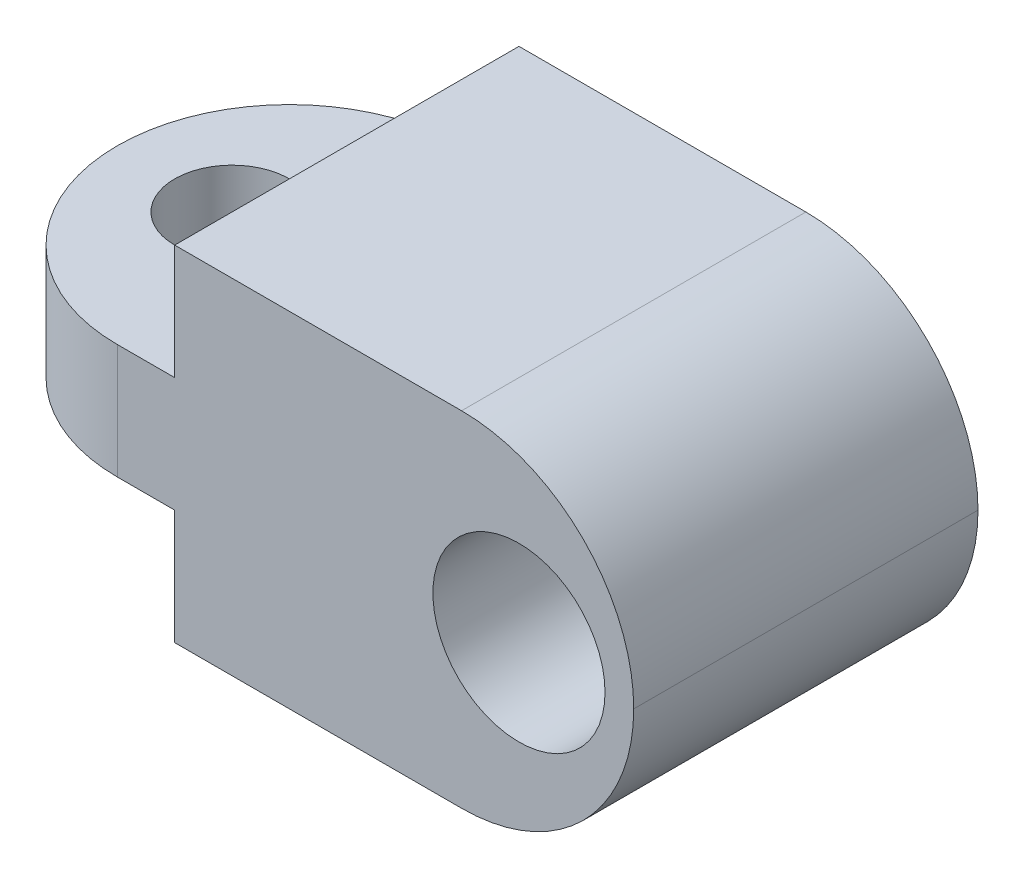
ISO-10303-21;
HEADER;
FILE_DESCRIPTION(('STEP AP214'),'2;1');
FILE_NAME('part.step','',(''),(''),'','','');
FILE_SCHEMA(('AUTOMOTIVE_DESIGN { 1 0 10303 214 1 1 1 1 }'));
ENDSEC;
DATA;
#1=APPLICATION_CONTEXT('core data for automotive mechanical design processes');
#2=APPLICATION_PROTOCOL_DEFINITION('international standard','automotive_design',2000,#1);
#3=PRODUCT_CONTEXT('',#1,'mechanical');
#4=PRODUCT('Part','Part','',(#3));
#5=PRODUCT_RELATED_PRODUCT_CATEGORY('part','',(#4));
#6=PRODUCT_DEFINITION_FORMATION('','',#4);
#7=PRODUCT_DEFINITION_CONTEXT('part definition',#1,'design');
#8=PRODUCT_DEFINITION('design','',#6,#7);
#9=PRODUCT_DEFINITION_SHAPE('','',#8);
#10=(LENGTH_UNIT() NAMED_UNIT(*) SI_UNIT(.MILLI.,.METRE.));
#11=(NAMED_UNIT(*) PLANE_ANGLE_UNIT() SI_UNIT($,.RADIAN.));
#12=(NAMED_UNIT(*) SI_UNIT($,.STERADIAN.) SOLID_ANGLE_UNIT());
#13=UNCERTAINTY_MEASURE_WITH_UNIT(LENGTH_MEASURE(1.E-05),#10,'distance_accuracy_value','');
#14=(GEOMETRIC_REPRESENTATION_CONTEXT(3) GLOBAL_UNCERTAINTY_ASSIGNED_CONTEXT((#13)) GLOBAL_UNIT_ASSIGNED_CONTEXT((#10,
#11,#12)) REPRESENTATION_CONTEXT('',''));
#15=CARTESIAN_POINT('',(0.,0.,0.));
#16=DIRECTION('',(0.,0.,1.));
#17=DIRECTION('',(1.,0.,0.));
#18=AXIS2_PLACEMENT_3D('',#15,#16,#17);
#19=CARTESIAN_POINT('',(-60.,30.,60.));
#20=DIRECTION('',(0.,-1.,0.));
#21=DIRECTION('',(0.,0.,-1.));
#22=AXIS2_PLACEMENT_3D('',#19,#20,#21);
#23=PLANE('',#22);
#24=DIRECTION('',(0.,0.,-1.));
#25=VECTOR('',#24,1.);
#26=CARTESIAN_POINT('',(-20.,30.,60.));
#27=LINE('',#26,#25);
#28=CARTESIAN_POINT('',(-20.,30.,60.));
#29=VERTEX_POINT('',#28);
#30=CARTESIAN_POINT('',(-20.,30.,0.));
#31=VERTEX_POINT('',#30);
#32=EDGE_CURVE('E133',#29,#31,#27,.T.);
#33=ORIENTED_EDGE('',*,*,#32,.F.);
#34=DIRECTION('',(-1.,0.,0.));
#35=VECTOR('',#34,1.);
#36=CARTESIAN_POINT('',(-60.,30.,60.));
#37=LINE('',#36,#35);
#38=CARTESIAN_POINT('',(30.,30.,60.));
#39=VERTEX_POINT('',#38);
#40=EDGE_CURVE('E138',#39,#29,#37,.T.);
#41=ORIENTED_EDGE('',*,*,#40,.F.);
#42=DIRECTION('',(0.,0.,-1.));
#43=VECTOR('',#42,1.);
#44=CARTESIAN_POINT('',(30.,30.,60.));
#45=LINE('',#44,#43);
#46=CARTESIAN_POINT('',(30.,30.,0.));
#47=VERTEX_POINT('',#46);
#48=EDGE_CURVE('E182',#39,#47,#45,.T.);
#49=ORIENTED_EDGE('',*,*,#48,.T.);
#50=DIRECTION('',(-1.,0.,0.));
#51=VECTOR('',#50,1.);
#52=CARTESIAN_POINT('',(-60.,30.,0.));
#53=LINE('',#52,#51);
#54=EDGE_CURVE('E167',#47,#31,#53,.T.);
#55=ORIENTED_EDGE('',*,*,#54,.T.);
#56=EDGE_LOOP('',(#33,#41,#49,#55));
#57=FACE_BOUND('',#56,.T.);
#58=ADVANCED_FACE('F39',(#57),#23,.F.);
#59=CARTESIAN_POINT('',(-60.,-30.,60.));
#60=DIRECTION('',(0.,1.,0.));
#61=DIRECTION('',(0.,0.,1.));
#62=AXIS2_PLACEMENT_3D('',#59,#60,#61);
#63=PLANE('',#62);
#64=DIRECTION('',(0.,0.,-1.));
#65=VECTOR('',#64,1.);
#66=CARTESIAN_POINT('',(-20.,-30.,60.));
#67=LINE('',#66,#65);
#68=CARTESIAN_POINT('',(-20.,-30.,60.));
#69=VERTEX_POINT('',#68);
#70=CARTESIAN_POINT('',(-20.,-30.,0.));
#71=VERTEX_POINT('',#70);
#72=EDGE_CURVE('E145',#69,#71,#67,.T.);
#73=ORIENTED_EDGE('',*,*,#72,.T.);
#74=DIRECTION('',(1.,0.,0.));
#75=VECTOR('',#74,1.);
#76=CARTESIAN_POINT('',(-60.,-30.,0.));
#77=LINE('',#76,#75);
#78=CARTESIAN_POINT('',(30.,-30.,0.));
#79=VERTEX_POINT('',#78);
#80=EDGE_CURVE('E164',#71,#79,#77,.T.);
#81=ORIENTED_EDGE('',*,*,#80,.T.);
#82=DIRECTION('',(0.,0.,-1.));
#83=VECTOR('',#82,1.);
#84=CARTESIAN_POINT('',(30.,-30.,60.));
#85=LINE('',#84,#83);
#86=CARTESIAN_POINT('',(30.,-30.,60.));
#87=VERTEX_POINT('',#86);
#88=EDGE_CURVE('E175',#79,#87,#85,.F.);
#89=ORIENTED_EDGE('',*,*,#88,.T.);
#90=DIRECTION('',(1.,0.,0.));
#91=VECTOR('',#90,1.);
#92=CARTESIAN_POINT('',(-60.,-30.,60.));
#93=LINE('',#92,#91);
#94=EDGE_CURVE('E163',#69,#87,#93,.T.);
#95=ORIENTED_EDGE('',*,*,#94,.F.);
#96=EDGE_LOOP('',(#73,#81,#89,#95));
#97=FACE_BOUND('',#96,.T.);
#98=ADVANCED_FACE('F232',(#97),#63,.F.);
#99=CARTESIAN_POINT('',(0.,0.,60.));
#100=DIRECTION('',(0.,0.,-1.));
#101=DIRECTION('',(-1.,0.,0.));
#102=AXIS2_PLACEMENT_3D('',#99,#100,#101);
#103=PLANE('',#102);
#104=CARTESIAN_POINT('',(40.,0.,60.0000000000001));
#105=DIRECTION('',(0.,0.,1.));
#106=DIRECTION('',(1.,0.,0.));
#107=AXIS2_PLACEMENT_3D('',#104,#105,#106);
#108=CIRCLE('',#107,15.);
#109=CARTESIAN_POINT('',(55.,0.,60.0000000000001));
#110=VERTEX_POINT('',#109);
#111=EDGE_CURVE('E204',#110,#110,#108,.T.);
#112=ORIENTED_EDGE('',*,*,#111,.F.);
#113=EDGE_LOOP('',(#112));
#114=FACE_BOUND('',#113,.T.);
#115=DIRECTION('',(1.,0.,0.));
#116=VECTOR('',#115,1.);
#117=CARTESIAN_POINT('',(-60.,10.,60.));
#118=LINE('',#117,#116);
#119=CARTESIAN_POINT('',(-30.,10.,60.));
#120=VERTEX_POINT('',#119);
#121=CARTESIAN_POINT('',(-20.,10.,60.));
#122=VERTEX_POINT('',#121);
#123=EDGE_CURVE('E115',#120,#122,#118,.T.);
#124=ORIENTED_EDGE('',*,*,#123,.F.);
#125=DIRECTION('',(0.,-1.,0.));
#126=VECTOR('',#125,1.);
#127=CARTESIAN_POINT('',(-30.,0.,60.));
#128=LINE('',#127,#126);
#129=CARTESIAN_POINT('',(-30.,-10.,60.));
#130=VERTEX_POINT('',#129);
#131=EDGE_CURVE('E184',#120,#130,#128,.T.);
#132=ORIENTED_EDGE('',*,*,#131,.T.);
#133=DIRECTION('',(-1.,0.,0.));
#134=VECTOR('',#133,1.);
#135=CARTESIAN_POINT('',(-60.,-10.,60.));
#136=LINE('',#135,#134);
#137=CARTESIAN_POINT('',(-20.,-10.,60.));
#138=VERTEX_POINT('',#137);
#139=EDGE_CURVE('E149',#138,#130,#136,.T.);
#140=ORIENTED_EDGE('',*,*,#139,.F.);
#141=DIRECTION('',(0.,1.,0.));
#142=VECTOR('',#141,1.);
#143=CARTESIAN_POINT('',(-20.,-30.,60.));
#144=LINE('',#143,#142);
#145=EDGE_CURVE('E147',#69,#138,#144,.T.);
#146=ORIENTED_EDGE('',*,*,#145,.F.);
#147=ORIENTED_EDGE('',*,*,#94,.T.);
#148=CARTESIAN_POINT('',(30.,0.,60.));
#149=DIRECTION('',(0.,0.,-1.));
#150=DIRECTION('',(-1.,0.,0.));
#151=AXIS2_PLACEMENT_3D('',#148,#149,#150);
#152=CIRCLE('',#151,30.);
#153=CARTESIAN_POINT('',(60.,0.,60.));
#154=VERTEX_POINT('',#153);
#155=EDGE_CURVE('E180',#87,#154,#152,.F.);
#156=ORIENTED_EDGE('',*,*,#155,.T.);
#157=CARTESIAN_POINT('',(30.,0.,60.));
#158=DIRECTION('',(0.,0.,-1.));
#159=DIRECTION('',(-1.,0.,0.));
#160=AXIS2_PLACEMENT_3D('',#157,#158,#159);
#161=CIRCLE('',#160,30.);
#162=EDGE_CURVE('E178',#154,#39,#161,.F.);
#163=ORIENTED_EDGE('',*,*,#162,.T.);
#164=ORIENTED_EDGE('',*,*,#40,.T.);
#165=DIRECTION('',(0.,1.,0.));
#166=VECTOR('',#165,1.);
#167=CARTESIAN_POINT('',(-20.,30.,60.));
#168=LINE('',#167,#166);
#169=EDGE_CURVE('E125',#122,#29,#168,.T.);
#170=ORIENTED_EDGE('',*,*,#169,.F.);
#171=EDGE_LOOP('',(#124,#132,#140,#146,#147,#156,#163,#164,#170));
#172=FACE_BOUND('',#171,.T.);
#173=ADVANCED_FACE('F136',(#114,#172),#103,.F.);
#174=CARTESIAN_POINT('',(0.,0.,0.));
#175=DIRECTION('',(0.,0.,-1.));
#176=DIRECTION('',(-1.,0.,0.));
#177=AXIS2_PLACEMENT_3D('',#174,#175,#176);
#178=PLANE('',#177);
#179=CARTESIAN_POINT('',(40.,0.,0.));
#180=DIRECTION('',(0.,0.,1.));
#181=DIRECTION('',(1.,0.,0.));
#182=AXIS2_PLACEMENT_3D('',#179,#180,#181);
#183=CIRCLE('',#182,15.);
#184=CARTESIAN_POINT('',(55.,0.,0.));
#185=VERTEX_POINT('',#184);
#186=EDGE_CURVE('E208',#185,#185,#183,.T.);
#187=ORIENTED_EDGE('',*,*,#186,.T.);
#188=EDGE_LOOP('',(#187));
#189=FACE_BOUND('',#188,.T.);
#190=DIRECTION('',(-1.,0.,0.));
#191=VECTOR('',#190,1.);
#192=CARTESIAN_POINT('',(-60.,-10.,0.));
#193=LINE('',#192,#191);
#194=CARTESIAN_POINT('',(-20.,-10.,0.));
#195=VERTEX_POINT('',#194);
#196=CARTESIAN_POINT('',(-30.,-10.,0.));
#197=VERTEX_POINT('',#196);
#198=EDGE_CURVE('E150',#195,#197,#193,.T.);
#199=ORIENTED_EDGE('',*,*,#198,.T.);
#200=DIRECTION('',(0.,-1.,0.));
#201=VECTOR('',#200,1.);
#202=CARTESIAN_POINT('',(-30.,10.,0.));
#203=LINE('',#202,#201);
#204=CARTESIAN_POINT('',(-30.,10.,0.));
#205=VERTEX_POINT('',#204);
#206=EDGE_CURVE('E11',#197,#205,#203,.F.);
#207=ORIENTED_EDGE('',*,*,#206,.T.);
#208=DIRECTION('',(1.,0.,0.));
#209=VECTOR('',#208,1.);
#210=CARTESIAN_POINT('',(-60.,10.,0.));
#211=LINE('',#210,#209);
#212=CARTESIAN_POINT('',(-20.,10.,0.));
#213=VERTEX_POINT('',#212);
#214=EDGE_CURVE('E143',#205,#213,#211,.T.);
#215=ORIENTED_EDGE('',*,*,#214,.T.);
#216=DIRECTION('',(0.,1.,0.));
#217=VECTOR('',#216,1.);
#218=CARTESIAN_POINT('',(-20.,30.,0.));
#219=LINE('',#218,#217);
#220=EDGE_CURVE('E126',#213,#31,#219,.T.);
#221=ORIENTED_EDGE('',*,*,#220,.T.);
#222=ORIENTED_EDGE('',*,*,#54,.F.);
#223=CARTESIAN_POINT('',(30.,0.,0.));
#224=DIRECTION('',(0.,0.,-1.));
#225=DIRECTION('',(-1.,0.,0.));
#226=AXIS2_PLACEMENT_3D('',#223,#224,#225);
#227=CIRCLE('',#226,30.);
#228=CARTESIAN_POINT('',(60.,0.,0.));
#229=VERTEX_POINT('',#228);
#230=EDGE_CURVE('E166',#47,#229,#227,.T.);
#231=ORIENTED_EDGE('',*,*,#230,.T.);
#232=CARTESIAN_POINT('',(30.,0.,0.));
#233=DIRECTION('',(0.,0.,-1.));
#234=DIRECTION('',(-1.,0.,0.));
#235=AXIS2_PLACEMENT_3D('',#232,#233,#234);
#236=CIRCLE('',#235,30.);
#237=EDGE_CURVE('E172',#229,#79,#236,.T.);
#238=ORIENTED_EDGE('',*,*,#237,.T.);
#239=ORIENTED_EDGE('',*,*,#80,.F.);
#240=DIRECTION('',(0.,1.,0.));
#241=VECTOR('',#240,1.);
#242=CARTESIAN_POINT('',(-20.,-30.,0.));
#243=LINE('',#242,#241);
#244=EDGE_CURVE('E154',#71,#195,#243,.T.);
#245=ORIENTED_EDGE('',*,*,#244,.T.);
#246=EDGE_LOOP('',(#199,#207,#215,#221,#222,#231,#238,#239,#245));
#247=FACE_BOUND('',#246,.T.);
#248=ADVANCED_FACE('F248',(#189,#247),#178,.T.);
#249=CARTESIAN_POINT('',(30.,0.,60.));
#250=DIRECTION('',(0.,0.,-1.));
#251=DIRECTION('',(-1.,0.,0.));
#252=AXIS2_PLACEMENT_3D('',#249,#250,#251);
#253=CYLINDRICAL_SURFACE('',#252,30.);
#254=ORIENTED_EDGE('',*,*,#48,.F.);
#255=ORIENTED_EDGE('',*,*,#162,.F.);
#256=DIRECTION('',(0.,0.,-1.));
#257=VECTOR('',#256,1.);
#258=CARTESIAN_POINT('',(60.,0.,60.));
#259=LINE('',#258,#257);
#260=EDGE_CURVE('E132',#229,#154,#259,.F.);
#261=ORIENTED_EDGE('',*,*,#260,.F.);
#262=ORIENTED_EDGE('',*,*,#230,.F.);
#263=EDGE_LOOP('',(#254,#255,#261,#262));
#264=FACE_BOUND('',#263,.T.);
#265=ADVANCED_FACE('F245',(#264),#253,.T.);
#266=CARTESIAN_POINT('',(30.,0.,60.));
#267=DIRECTION('',(0.,0.,-1.));
#268=DIRECTION('',(-1.,0.,0.));
#269=AXIS2_PLACEMENT_3D('',#266,#267,#268);
#270=CYLINDRICAL_SURFACE('',#269,30.);
#271=ORIENTED_EDGE('',*,*,#155,.F.);
#272=ORIENTED_EDGE('',*,*,#88,.F.);
#273=ORIENTED_EDGE('',*,*,#237,.F.);
#274=ORIENTED_EDGE('',*,*,#260,.T.);
#275=EDGE_LOOP('',(#271,#272,#273,#274));
#276=FACE_BOUND('',#275,.T.);
#277=ADVANCED_FACE('F242',(#276),#270,.T.);
#278=CARTESIAN_POINT('',(-20.,-30.,60.));
#279=DIRECTION('',(-1.,0.,0.));
#280=DIRECTION('',(0.,0.,1.));
#281=AXIS2_PLACEMENT_3D('',#278,#279,#280);
#282=PLANE('',#281);
#283=ORIENTED_EDGE('',*,*,#244,.F.);
#284=ORIENTED_EDGE('',*,*,#72,.F.);
#285=ORIENTED_EDGE('',*,*,#145,.T.);
#286=DIRECTION('',(0.,0.,-1.));
#287=VECTOR('',#286,1.);
#288=CARTESIAN_POINT('',(-20.,-10.,60.));
#289=LINE('',#288,#287);
#290=EDGE_CURVE('E153',#138,#195,#289,.T.);
#291=ORIENTED_EDGE('',*,*,#290,.T.);
#292=EDGE_LOOP('',(#283,#284,#285,#291));
#293=FACE_BOUND('',#292,.T.);
#294=ADVANCED_FACE('F228',(#293),#282,.T.);
#295=CARTESIAN_POINT('',(-60.,-10.,60.));
#296=DIRECTION('',(0.,-1.,0.));
#297=DIRECTION('',(0.,0.,-1.));
#298=AXIS2_PLACEMENT_3D('',#295,#296,#297);
#299=PLANE('',#298);
#300=CARTESIAN_POINT('',(-40.,-10.,30.));
#301=DIRECTION('',(0.,1.,0.));
#302=DIRECTION('',(0.,0.,1.));
#303=AXIS2_PLACEMENT_3D('',#300,#301,#302);
#304=CIRCLE('',#303,10.);
#305=CARTESIAN_POINT('',(-40.,-10.,40.));
#306=VERTEX_POINT('',#305);
#307=EDGE_CURVE('E203',#306,#306,#304,.T.);
#308=ORIENTED_EDGE('',*,*,#307,.T.);
#309=EDGE_LOOP('',(#308));
#310=FACE_BOUND('',#309,.T.);
#311=ORIENTED_EDGE('',*,*,#139,.T.);
#312=CARTESIAN_POINT('',(-30.,-10.,30.));
#313=DIRECTION('',(0.,-1.,0.));
#314=DIRECTION('',(0.,0.,-1.));
#315=AXIS2_PLACEMENT_3D('',#312,#313,#314);
#316=CIRCLE('',#315,30.);
#317=CARTESIAN_POINT('',(-60.,-10.,30.));
#318=VERTEX_POINT('',#317);
#319=EDGE_CURVE('E190',#130,#318,#316,.T.);
#320=ORIENTED_EDGE('',*,*,#319,.T.);
#321=CARTESIAN_POINT('',(-30.,-10.,30.));
#322=DIRECTION('',(0.,-1.,0.));
#323=DIRECTION('',(0.,0.,-1.));
#324=AXIS2_PLACEMENT_3D('',#321,#322,#323);
#325=CIRCLE('',#324,30.);
#326=EDGE_CURVE('E188',#318,#197,#325,.T.);
#327=ORIENTED_EDGE('',*,*,#326,.T.);
#328=ORIENTED_EDGE('',*,*,#198,.F.);
#329=ORIENTED_EDGE('',*,*,#290,.F.);
#330=EDGE_LOOP('',(#311,#320,#327,#328,#329));
#331=FACE_BOUND('',#330,.T.);
#332=ADVANCED_FACE('F195',(#310,#331),#299,.T.);
#333=CARTESIAN_POINT('',(-60.,10.,60.));
#334=DIRECTION('',(0.,1.,0.));
#335=DIRECTION('',(0.,0.,1.));
#336=AXIS2_PLACEMENT_3D('',#333,#334,#335);
#337=PLANE('',#336);
#338=CARTESIAN_POINT('',(-40.,10.,30.));
#339=DIRECTION('',(0.,1.,0.));
#340=DIRECTION('',(0.,0.,1.));
#341=AXIS2_PLACEMENT_3D('',#338,#339,#340);
#342=CIRCLE('',#341,10.);
#343=CARTESIAN_POINT('',(-40.,10.,40.));
#344=VERTEX_POINT('',#343);
#345=EDGE_CURVE('E157',#344,#344,#342,.T.);
#346=ORIENTED_EDGE('',*,*,#345,.F.);
#347=EDGE_LOOP('',(#346));
#348=FACE_BOUND('',#347,.T.);
#349=CARTESIAN_POINT('',(-30.,10.,30.));
#350=DIRECTION('',(0.,1.,0.));
#351=DIRECTION('',(0.,0.,1.));
#352=AXIS2_PLACEMENT_3D('',#349,#350,#351);
#353=CIRCLE('',#352,30.);
#354=CARTESIAN_POINT('',(-60.,10.,30.));
#355=VERTEX_POINT('',#354);
#356=EDGE_CURVE('E55',#205,#355,#353,.T.);
#357=ORIENTED_EDGE('',*,*,#356,.T.);
#358=CARTESIAN_POINT('',(-30.,10.,30.));
#359=DIRECTION('',(0.,1.,0.));
#360=DIRECTION('',(0.,0.,1.));
#361=AXIS2_PLACEMENT_3D('',#358,#359,#360);
#362=CIRCLE('',#361,30.);
#363=EDGE_CURVE('E48',#355,#120,#362,.T.);
#364=ORIENTED_EDGE('',*,*,#363,.T.);
#365=ORIENTED_EDGE('',*,*,#123,.T.);
#366=DIRECTION('',(0.,0.,-1.));
#367=VECTOR('',#366,1.);
#368=CARTESIAN_POINT('',(-20.,10.,60.));
#369=LINE('',#368,#367);
#370=EDGE_CURVE('E118',#122,#213,#369,.T.);
#371=ORIENTED_EDGE('',*,*,#370,.T.);
#372=ORIENTED_EDGE('',*,*,#214,.F.);
#373=EDGE_LOOP('',(#357,#364,#365,#371,#372));
#374=FACE_BOUND('',#373,.T.);
#375=ADVANCED_FACE('F117',(#348,#374),#337,.T.);
#376=CARTESIAN_POINT('',(-20.,30.,60.));
#377=DIRECTION('',(-1.,0.,0.));
#378=DIRECTION('',(0.,-1.,0.));
#379=AXIS2_PLACEMENT_3D('',#376,#377,#378);
#380=PLANE('',#379);
#381=ORIENTED_EDGE('',*,*,#220,.F.);
#382=ORIENTED_EDGE('',*,*,#370,.F.);
#383=ORIENTED_EDGE('',*,*,#169,.T.);
#384=ORIENTED_EDGE('',*,*,#32,.T.);
#385=EDGE_LOOP('',(#381,#382,#383,#384));
#386=FACE_BOUND('',#385,.T.);
#387=ADVANCED_FACE('F129',(#386),#380,.T.);
#388=CARTESIAN_POINT('',(-40.,10.,30.));
#389=DIRECTION('',(0.,-1.,0.));
#390=DIRECTION('',(0.,0.,-1.));
#391=AXIS2_PLACEMENT_3D('',#388,#389,#390);
#392=CYLINDRICAL_SURFACE('',#391,10.);
#393=ORIENTED_EDGE('',*,*,#345,.T.);
#394=EDGE_LOOP('',(#393));
#395=FACE_BOUND('',#394,.T.);
#396=ORIENTED_EDGE('',*,*,#307,.F.);
#397=EDGE_LOOP('',(#396));
#398=FACE_BOUND('',#397,.T.);
#399=ADVANCED_FACE('F217',(#395,#398),#392,.F.);
#400=CARTESIAN_POINT('',(-30.,-30.,30.));
#401=DIRECTION('',(0.,1.,0.));
#402=DIRECTION('',(0.,0.,1.));
#403=AXIS2_PLACEMENT_3D('',#400,#401,#402);
#404=CYLINDRICAL_SURFACE('',#403,30.);
#405=DIRECTION('',(0.,-1.,0.));
#406=VECTOR('',#405,1.);
#407=CARTESIAN_POINT('',(-60.,-10.,30.));
#408=LINE('',#407,#406);
#409=EDGE_CURVE('E43',#355,#318,#408,.T.);
#410=ORIENTED_EDGE('',*,*,#409,.F.);
#411=ORIENTED_EDGE('',*,*,#356,.F.);
#412=ORIENTED_EDGE('',*,*,#206,.F.);
#413=ORIENTED_EDGE('',*,*,#326,.F.);
#414=EDGE_LOOP('',(#410,#411,#412,#413));
#415=FACE_BOUND('',#414,.T.);
#416=ADVANCED_FACE('F41',(#415),#404,.T.);
#417=CARTESIAN_POINT('',(-30.,0.,30.));
#418=DIRECTION('',(0.,-1.,0.));
#419=DIRECTION('',(0.,0.,-1.));
#420=AXIS2_PLACEMENT_3D('',#417,#418,#419);
#421=CYLINDRICAL_SURFACE('',#420,30.);
#422=ORIENTED_EDGE('',*,*,#363,.F.);
#423=ORIENTED_EDGE('',*,*,#409,.T.);
#424=ORIENTED_EDGE('',*,*,#319,.F.);
#425=ORIENTED_EDGE('',*,*,#131,.F.);
#426=EDGE_LOOP('',(#422,#423,#424,#425));
#427=FACE_BOUND('',#426,.T.);
#428=ADVANCED_FACE('F202',(#427),#421,.T.);
#429=CARTESIAN_POINT('',(40.,0.,60.0000000000001));
#430=DIRECTION('',(0.,0.,-1.));
#431=DIRECTION('',(-1.,0.,0.));
#432=AXIS2_PLACEMENT_3D('',#429,#430,#431);
#433=CYLINDRICAL_SURFACE('',#432,15.);
#434=ORIENTED_EDGE('',*,*,#111,.T.);
#435=EDGE_LOOP('',(#434));
#436=FACE_BOUND('',#435,.T.);
#437=ORIENTED_EDGE('',*,*,#186,.F.);
#438=EDGE_LOOP('',(#437));
#439=FACE_BOUND('',#438,.T.);
#440=ADVANCED_FACE('F251',(#436,#439),#433,.F.);
#441=CLOSED_SHELL('',(#58,#98,#173,#248,#265,#277,#294,#332,#375,#387,#399,#416,#428,#440));
#442=MANIFOLD_SOLID_BREP('B2',#441);
#443=ADVANCED_BREP_SHAPE_REPRESENTATION('',(#18,#442),#14);
#444=SHAPE_DEFINITION_REPRESENTATION(#9,#443);
ENDSEC;
END-ISO-10303-21;
